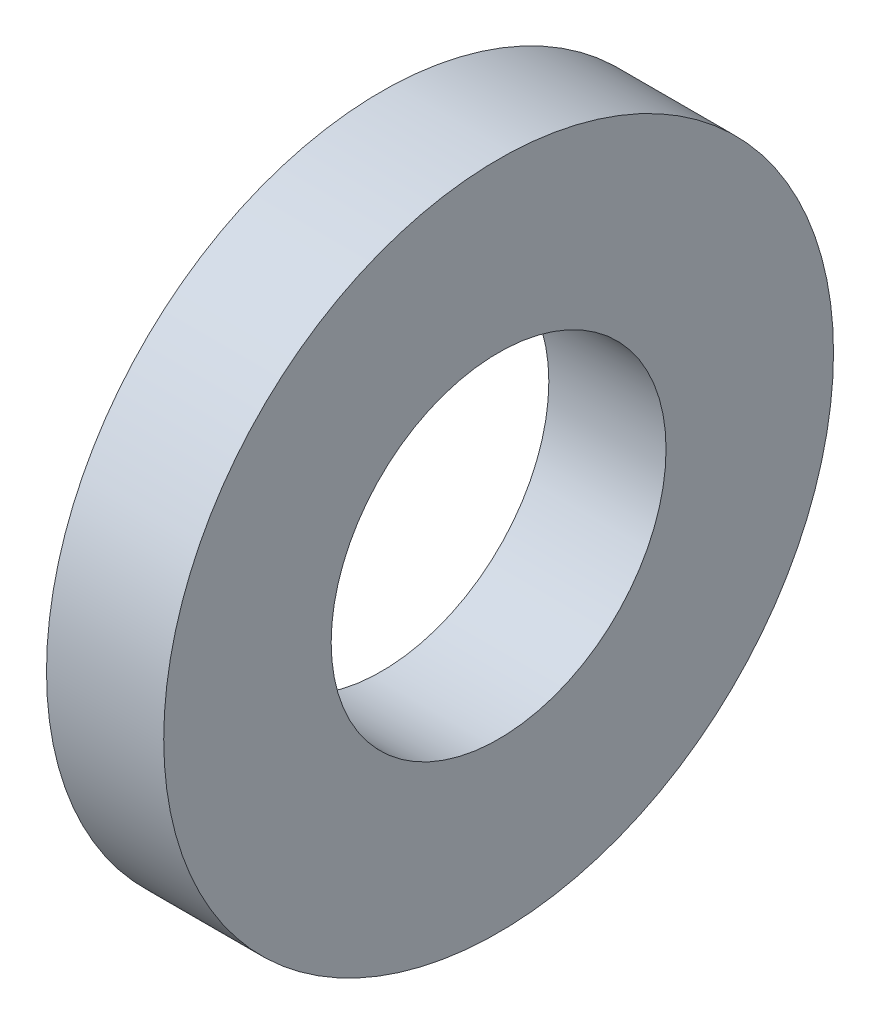
ISO-10303-21;
HEADER;
FILE_DESCRIPTION(('STEP AP214'),'2;1');
FILE_NAME('part.step','',(''),(''),'','','');
FILE_SCHEMA(('AUTOMOTIVE_DESIGN { 1 0 10303 214 1 1 1 1 }'));
ENDSEC;
DATA;
#1=APPLICATION_CONTEXT('core data for automotive mechanical design processes');
#2=APPLICATION_PROTOCOL_DEFINITION('international standard','automotive_design',2000,#1);
#3=PRODUCT_CONTEXT('',#1,'mechanical');
#4=PRODUCT('Part','Part','',(#3));
#5=PRODUCT_RELATED_PRODUCT_CATEGORY('part','',(#4));
#6=PRODUCT_DEFINITION_FORMATION('','',#4);
#7=PRODUCT_DEFINITION_CONTEXT('part definition',#1,'design');
#8=PRODUCT_DEFINITION('design','',#6,#7);
#9=PRODUCT_DEFINITION_SHAPE('','',#8);
#10=(LENGTH_UNIT() NAMED_UNIT(*) SI_UNIT(.MILLI.,.METRE.));
#11=(NAMED_UNIT(*) PLANE_ANGLE_UNIT() SI_UNIT($,.RADIAN.));
#12=(NAMED_UNIT(*) SI_UNIT($,.STERADIAN.) SOLID_ANGLE_UNIT());
#13=UNCERTAINTY_MEASURE_WITH_UNIT(LENGTH_MEASURE(1.E-05),#10,'distance_accuracy_value','');
#14=(GEOMETRIC_REPRESENTATION_CONTEXT(3) GLOBAL_UNCERTAINTY_ASSIGNED_CONTEXT((#13)) GLOBAL_UNIT_ASSIGNED_CONTEXT((#10,
#11,#12)) REPRESENTATION_CONTEXT('',''));
#15=CARTESIAN_POINT('',(0.,0.,0.));
#16=DIRECTION('',(0.,0.,1.));
#17=DIRECTION('',(1.,0.,0.));
#18=AXIS2_PLACEMENT_3D('',#15,#16,#17);
#19=CARTESIAN_POINT('',(3.5,0.,0.));
#20=DIRECTION('',(1.,0.,0.));
#21=DIRECTION('',(0.,0.,-1.));
#22=AXIS2_PLACEMENT_3D('',#19,#20,#21);
#23=PLANE('',#22);
#24=CARTESIAN_POINT('',(3.5,0.,0.));
#25=DIRECTION('',(1.,0.,0.));
#26=DIRECTION('',(0.,0.,-1.));
#27=AXIS2_PLACEMENT_3D('',#24,#25,#26);
#28=CIRCLE('',#27,10.);
#29=CARTESIAN_POINT('',(3.5,0.,-10.));
#30=VERTEX_POINT('',#29);
#31=EDGE_CURVE('E10',#30,#30,#28,.T.);
#32=ORIENTED_EDGE('',*,*,#31,.T.);
#33=EDGE_LOOP('',(#32));
#34=FACE_BOUND('',#33,.T.);
#35=CARTESIAN_POINT('',(3.5,0.,0.));
#36=DIRECTION('',(1.,0.,0.));
#37=DIRECTION('',(0.,0.,-1.));
#38=AXIS2_PLACEMENT_3D('',#35,#36,#37);
#39=CIRCLE('',#38,5.);
#40=CARTESIAN_POINT('',(3.5,0.,-5.));
#41=VERTEX_POINT('',#40);
#42=EDGE_CURVE('E54',#41,#41,#39,.T.);
#43=ORIENTED_EDGE('',*,*,#42,.F.);
#44=EDGE_LOOP('',(#43));
#45=FACE_BOUND('',#44,.T.);
#46=ADVANCED_FACE('F41',(#34,#45),#23,.T.);
#47=CARTESIAN_POINT('',(0.,0.,0.));
#48=DIRECTION('',(1.,0.,0.));
#49=DIRECTION('',(0.,0.,-1.));
#50=AXIS2_PLACEMENT_3D('',#47,#48,#49);
#51=PLANE('',#50);
#52=CARTESIAN_POINT('',(0.,0.,0.));
#53=DIRECTION('',(1.,0.,0.));
#54=DIRECTION('',(0.,0.,-1.));
#55=AXIS2_PLACEMENT_3D('',#52,#53,#54);
#56=CIRCLE('',#55,10.);
#57=CARTESIAN_POINT('',(0.,0.,-10.));
#58=VERTEX_POINT('',#57);
#59=EDGE_CURVE('E45',#58,#58,#56,.T.);
#60=ORIENTED_EDGE('',*,*,#59,.F.);
#61=EDGE_LOOP('',(#60));
#62=FACE_BOUND('',#61,.T.);
#63=CARTESIAN_POINT('',(0.,0.,0.));
#64=DIRECTION('',(1.,0.,0.));
#65=DIRECTION('',(0.,0.,-1.));
#66=AXIS2_PLACEMENT_3D('',#63,#64,#65);
#67=CIRCLE('',#66,5.);
#68=CARTESIAN_POINT('',(0.,0.,-5.));
#69=VERTEX_POINT('',#68);
#70=EDGE_CURVE('E56',#69,#69,#67,.T.);
#71=ORIENTED_EDGE('',*,*,#70,.T.);
#72=EDGE_LOOP('',(#71));
#73=FACE_BOUND('',#72,.T.);
#74=ADVANCED_FACE('F68',(#62,#73),#51,.F.);
#75=CARTESIAN_POINT('',(3.5,0.,0.));
#76=DIRECTION('',(-1.,0.,0.));
#77=DIRECTION('',(0.,0.,1.));
#78=AXIS2_PLACEMENT_3D('',#75,#76,#77);
#79=CYLINDRICAL_SURFACE('',#78,10.);
#80=ORIENTED_EDGE('',*,*,#31,.F.);
#81=EDGE_LOOP('',(#80));
#82=FACE_BOUND('',#81,.T.);
#83=ORIENTED_EDGE('',*,*,#59,.T.);
#84=EDGE_LOOP('',(#83));
#85=FACE_BOUND('',#84,.T.);
#86=ADVANCED_FACE('F43',(#82,#85),#79,.T.);
#87=CARTESIAN_POINT('',(3.5,0.,0.));
#88=DIRECTION('',(-1.,0.,0.));
#89=DIRECTION('',(0.,0.,1.));
#90=AXIS2_PLACEMENT_3D('',#87,#88,#89);
#91=CYLINDRICAL_SURFACE('',#90,5.);
#92=ORIENTED_EDGE('',*,*,#42,.T.);
#93=EDGE_LOOP('',(#92));
#94=FACE_BOUND('',#93,.T.);
#95=ORIENTED_EDGE('',*,*,#70,.F.);
#96=EDGE_LOOP('',(#95));
#97=FACE_BOUND('',#96,.T.);
#98=ADVANCED_FACE('F64',(#94,#97),#91,.F.);
#99=CLOSED_SHELL('',(#46,#74,#86,#98));
#100=MANIFOLD_SOLID_BREP('B2',#99);
#101=ADVANCED_BREP_SHAPE_REPRESENTATION('',(#18,#100),#14);
#102=SHAPE_DEFINITION_REPRESENTATION(#9,#101);
ENDSEC;
END-ISO-10303-21;
